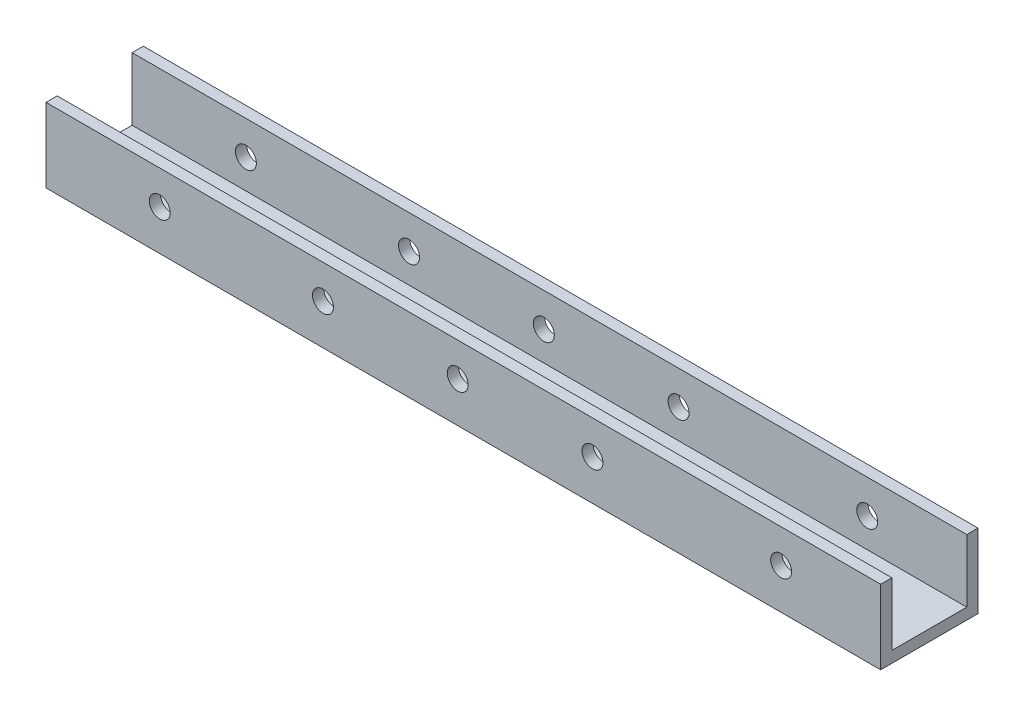
ISO-10303-21;
HEADER;
FILE_DESCRIPTION(('STEP AP214'),'2;1');
FILE_NAME('part.step','',(''),(''),'','','');
FILE_SCHEMA(('AUTOMOTIVE_DESIGN { 1 0 10303 214 1 1 1 1 }'));
ENDSEC;
DATA;
#1=APPLICATION_CONTEXT('core data for automotive mechanical design processes');
#2=APPLICATION_PROTOCOL_DEFINITION('international standard','automotive_design',2000,#1);
#3=PRODUCT_CONTEXT('',#1,'mechanical');
#4=PRODUCT('Part','Part','',(#3));
#5=PRODUCT_RELATED_PRODUCT_CATEGORY('part','',(#4));
#6=PRODUCT_DEFINITION_FORMATION('','',#4);
#7=PRODUCT_DEFINITION_CONTEXT('part definition',#1,'design');
#8=PRODUCT_DEFINITION('design','',#6,#7);
#9=PRODUCT_DEFINITION_SHAPE('','',#8);
#10=(LENGTH_UNIT() NAMED_UNIT(*) SI_UNIT(.MILLI.,.METRE.));
#11=(NAMED_UNIT(*) PLANE_ANGLE_UNIT() SI_UNIT($,.RADIAN.));
#12=(NAMED_UNIT(*) SI_UNIT($,.STERADIAN.) SOLID_ANGLE_UNIT());
#13=UNCERTAINTY_MEASURE_WITH_UNIT(LENGTH_MEASURE(1.E-05),#10,'distance_accuracy_value','');
#14=(GEOMETRIC_REPRESENTATION_CONTEXT(3) GLOBAL_UNCERTAINTY_ASSIGNED_CONTEXT((#13)) GLOBAL_UNIT_ASSIGNED_CONTEXT((#10,
#11,#12)) REPRESENTATION_CONTEXT('',''));
#15=CARTESIAN_POINT('',(0.,0.,0.));
#16=DIRECTION('',(0.,0.,1.));
#17=DIRECTION('',(1.,0.,0.));
#18=AXIS2_PLACEMENT_3D('',#15,#16,#17);
#19=CARTESIAN_POINT('',(0.,1.5,0.));
#20=DIRECTION('',(0.,-1.,0.));
#21=DIRECTION('',(0.,0.,-1.));
#22=AXIS2_PLACEMENT_3D('',#19,#20,#21);
#23=PLANE('',#22);
#24=DIRECTION('',(-1.,0.,0.));
#25=VECTOR('',#24,1.);
#26=CARTESIAN_POINT('',(0.,1.5,-1.5));
#27=LINE('',#26,#25);
#28=CARTESIAN_POINT('',(111.5,1.5,-1.5));
#29=VERTEX_POINT('',#28);
#30=CARTESIAN_POINT('',(0.,1.5,-1.5));
#31=VERTEX_POINT('',#30);
#32=EDGE_CURVE('E50',#29,#31,#27,.T.);
#33=ORIENTED_EDGE('',*,*,#32,.F.);
#34=DIRECTION('',(0.,0.,-1.));
#35=VECTOR('',#34,1.);
#36=CARTESIAN_POINT('',(111.5,1.5,-13.));
#37=LINE('',#36,#35);
#38=CARTESIAN_POINT('',(111.5,1.5,-11.5));
#39=VERTEX_POINT('',#38);
#40=EDGE_CURVE('E120',#29,#39,#37,.T.);
#41=ORIENTED_EDGE('',*,*,#40,.T.);
#42=DIRECTION('',(1.,0.,0.));
#43=VECTOR('',#42,1.);
#44=CARTESIAN_POINT('',(0.,1.5,-11.5));
#45=LINE('',#44,#43);
#46=CARTESIAN_POINT('',(0.,1.5,-11.5));
#47=VERTEX_POINT('',#46);
#48=EDGE_CURVE('E121',#47,#39,#45,.T.);
#49=ORIENTED_EDGE('',*,*,#48,.F.);
#50=DIRECTION('',(0.,0.,1.));
#51=VECTOR('',#50,1.);
#52=CARTESIAN_POINT('',(0.,1.5,0.));
#53=LINE('',#52,#51);
#54=EDGE_CURVE('E55',#47,#31,#53,.T.);
#55=ORIENTED_EDGE('',*,*,#54,.T.);
#56=EDGE_LOOP('',(#33,#41,#49,#55));
#57=FACE_BOUND('',#56,.T.);
#58=ADVANCED_FACE('F33',(#57),#23,.F.);
#59=CARTESIAN_POINT('',(111.5,1.5,0.));
#60=DIRECTION('',(0.,0.,-1.));
#61=DIRECTION('',(-1.,0.,0.));
#62=AXIS2_PLACEMENT_3D('',#59,#60,#61);
#63=PLANE('',#62);
#64=CARTESIAN_POINT('',(98.2002784814316,5.4,0.));
#65=DIRECTION('',(0.,0.,1.));
#66=DIRECTION('',(1.,0.,0.));
#67=AXIS2_PLACEMENT_3D('',#64,#65,#66);
#68=CIRCLE('',#67,1.4);
#69=CARTESIAN_POINT('',(99.6002784814316,5.4,0.));
#70=VERTEX_POINT('',#69);
#71=EDGE_CURVE('E459',#70,#70,#68,.T.);
#72=ORIENTED_EDGE('',*,*,#71,.F.);
#73=EDGE_LOOP('',(#72));
#74=FACE_BOUND('',#73,.T.);
#75=CARTESIAN_POINT('',(15.2002784814316,5.4,0.));
#76=DIRECTION('',(0.,0.,1.));
#77=DIRECTION('',(1.,0.,0.));
#78=AXIS2_PLACEMENT_3D('',#75,#76,#77);
#79=CIRCLE('',#78,1.4);
#80=CARTESIAN_POINT('',(16.6002784814316,5.4,0.));
#81=VERTEX_POINT('',#80);
#82=EDGE_CURVE('E173',#81,#81,#79,.T.);
#83=ORIENTED_EDGE('',*,*,#82,.F.);
#84=EDGE_LOOP('',(#83));
#85=FACE_BOUND('',#84,.T.);
#86=CARTESIAN_POINT('',(73.,5.4,0.));
#87=DIRECTION('',(0.,0.,1.));
#88=DIRECTION('',(1.,0.,0.));
#89=AXIS2_PLACEMENT_3D('',#86,#87,#88);
#90=CIRCLE('',#89,1.39999999999999);
#91=CARTESIAN_POINT('',(74.4,5.4,0.));
#92=VERTEX_POINT('',#91);
#93=EDGE_CURVE('E169',#92,#92,#90,.T.);
#94=ORIENTED_EDGE('',*,*,#93,.F.);
#95=EDGE_LOOP('',(#94));
#96=FACE_BOUND('',#95,.T.);
#97=CARTESIAN_POINT('',(55.,5.4,0.));
#98=DIRECTION('',(0.,0.,1.));
#99=DIRECTION('',(1.,0.,0.));
#100=AXIS2_PLACEMENT_3D('',#97,#98,#99);
#101=CIRCLE('',#100,1.4);
#102=CARTESIAN_POINT('',(56.4,5.4,0.));
#103=VERTEX_POINT('',#102);
#104=EDGE_CURVE('E165',#103,#103,#101,.T.);
#105=ORIENTED_EDGE('',*,*,#104,.F.);
#106=EDGE_LOOP('',(#105));
#107=FACE_BOUND('',#106,.T.);
#108=CARTESIAN_POINT('',(37.,5.4,0.));
#109=DIRECTION('',(0.,0.,1.));
#110=DIRECTION('',(1.,0.,0.));
#111=AXIS2_PLACEMENT_3D('',#108,#109,#110);
#112=CIRCLE('',#111,1.4);
#113=CARTESIAN_POINT('',(38.4,5.4,0.));
#114=VERTEX_POINT('',#113);
#115=EDGE_CURVE('E160',#114,#114,#112,.T.);
#116=ORIENTED_EDGE('',*,*,#115,.F.);
#117=EDGE_LOOP('',(#116));
#118=FACE_BOUND('',#117,.T.);
#119=DIRECTION('',(1.,0.,0.));
#120=VECTOR('',#119,1.);
#121=CARTESIAN_POINT('',(111.5,0.,0.));
#122=LINE('',#121,#120);
#123=CARTESIAN_POINT('',(0.,0.,0.));
#124=VERTEX_POINT('',#123);
#125=CARTESIAN_POINT('',(111.5,0.,0.));
#126=VERTEX_POINT('',#125);
#127=EDGE_CURVE('E151',#124,#126,#122,.T.);
#128=ORIENTED_EDGE('',*,*,#127,.T.);
#129=DIRECTION('',(0.,-1.,0.));
#130=VECTOR('',#129,1.);
#131=CARTESIAN_POINT('',(111.5,1.5,0.));
#132=LINE('',#131,#130);
#133=CARTESIAN_POINT('',(111.5,9.9,0.));
#134=VERTEX_POINT('',#133);
#135=EDGE_CURVE('E11',#134,#126,#132,.T.);
#136=ORIENTED_EDGE('',*,*,#135,.F.);
#137=DIRECTION('',(1.,0.,0.));
#138=VECTOR('',#137,1.);
#139=CARTESIAN_POINT('',(111.5,9.9,0.));
#140=LINE('',#139,#138);
#141=CARTESIAN_POINT('',(0.,9.9,0.));
#142=VERTEX_POINT('',#141);
#143=EDGE_CURVE('E115',#142,#134,#140,.T.);
#144=ORIENTED_EDGE('',*,*,#143,.F.);
#145=DIRECTION('',(0.,-1.,0.));
#146=VECTOR('',#145,1.);
#147=CARTESIAN_POINT('',(0.,1.5,0.));
#148=LINE('',#147,#146);
#149=EDGE_CURVE('E217',#142,#124,#148,.T.);
#150=ORIENTED_EDGE('',*,*,#149,.T.);
#151=EDGE_LOOP('',(#128,#136,#144,#150));
#152=FACE_BOUND('',#151,.T.);
#153=ADVANCED_FACE('F35',(#74,#85,#96,#107,#118,#152),#63,.F.);
#154=CARTESIAN_POINT('',(111.5,1.5,-13.));
#155=DIRECTION('',(-1.,0.,0.));
#156=DIRECTION('',(0.,0.,1.));
#157=AXIS2_PLACEMENT_3D('',#154,#155,#156);
#158=PLANE('',#157);
#159=DIRECTION('',(0.,0.,-1.));
#160=VECTOR('',#159,1.);
#161=CARTESIAN_POINT('',(111.5,0.,-13.));
#162=LINE('',#161,#160);
#163=CARTESIAN_POINT('',(111.5,0.,-13.));
#164=VERTEX_POINT('',#163);
#165=EDGE_CURVE('E221',#126,#164,#162,.T.);
#166=ORIENTED_EDGE('',*,*,#165,.T.);
#167=DIRECTION('',(0.,-1.,0.));
#168=VECTOR('',#167,1.);
#169=CARTESIAN_POINT('',(111.5,1.5,-13.));
#170=LINE('',#169,#168);
#171=CARTESIAN_POINT('',(111.5,9.9,-13.));
#172=VERTEX_POINT('',#171);
#173=EDGE_CURVE('E42',#172,#164,#170,.T.);
#174=ORIENTED_EDGE('',*,*,#173,.F.);
#175=DIRECTION('',(0.,0.,-1.));
#176=VECTOR('',#175,1.);
#177=CARTESIAN_POINT('',(111.5,9.9,-11.5));
#178=LINE('',#177,#176);
#179=CARTESIAN_POINT('',(111.5,9.9,-11.5));
#180=VERTEX_POINT('',#179);
#181=EDGE_CURVE('E135',#180,#172,#178,.T.);
#182=ORIENTED_EDGE('',*,*,#181,.F.);
#183=DIRECTION('',(0.,-1.,0.));
#184=VECTOR('',#183,1.);
#185=CARTESIAN_POINT('',(111.5,9.9,-11.5));
#186=LINE('',#185,#184);
#187=EDGE_CURVE('E138',#180,#39,#186,.T.);
#188=ORIENTED_EDGE('',*,*,#187,.T.);
#189=ORIENTED_EDGE('',*,*,#40,.F.);
#190=DIRECTION('',(0.,-1.,0.));
#191=VECTOR('',#190,1.);
#192=CARTESIAN_POINT('',(111.5,9.9,-1.5));
#193=LINE('',#192,#191);
#194=CARTESIAN_POINT('',(111.5,9.9,-1.5));
#195=VERTEX_POINT('',#194);
#196=EDGE_CURVE('E102',#195,#29,#193,.T.);
#197=ORIENTED_EDGE('',*,*,#196,.F.);
#198=DIRECTION('',(0.,0.,-1.));
#199=VECTOR('',#198,1.);
#200=CARTESIAN_POINT('',(111.5,9.9,-1.5));
#201=LINE('',#200,#199);
#202=EDGE_CURVE('E109',#134,#195,#201,.T.);
#203=ORIENTED_EDGE('',*,*,#202,.F.);
#204=ORIENTED_EDGE('',*,*,#135,.T.);
#205=EDGE_LOOP('',(#166,#174,#182,#188,#189,#197,#203,#204));
#206=FACE_BOUND('',#205,.T.);
#207=ADVANCED_FACE('F118',(#206),#158,.F.);
#208=CARTESIAN_POINT('',(0.,1.5,-13.));
#209=DIRECTION('',(0.,0.,1.));
#210=DIRECTION('',(1.,0.,0.));
#211=AXIS2_PLACEMENT_3D('',#208,#209,#210);
#212=PLANE('',#211);
#213=CARTESIAN_POINT('',(98.2002784814316,5.4,-13.));
#214=DIRECTION('',(0.,0.,1.));
#215=DIRECTION('',(1.,0.,0.));
#216=AXIS2_PLACEMENT_3D('',#213,#214,#215);
#217=CIRCLE('',#216,1.4);
#218=CARTESIAN_POINT('',(99.6002784814316,5.4,-13.));
#219=VERTEX_POINT('',#218);
#220=EDGE_CURVE('E180',#219,#219,#217,.T.);
#221=ORIENTED_EDGE('',*,*,#220,.T.);
#222=EDGE_LOOP('',(#221));
#223=FACE_BOUND('',#222,.T.);
#224=CARTESIAN_POINT('',(15.2002784814316,5.4,-13.));
#225=DIRECTION('',(0.,0.,1.));
#226=DIRECTION('',(1.,0.,0.));
#227=AXIS2_PLACEMENT_3D('',#224,#225,#226);
#228=CIRCLE('',#227,1.4);
#229=CARTESIAN_POINT('',(16.6002784814316,5.4,-13.));
#230=VERTEX_POINT('',#229);
#231=EDGE_CURVE('E177',#230,#230,#228,.T.);
#232=ORIENTED_EDGE('',*,*,#231,.T.);
#233=EDGE_LOOP('',(#232));
#234=FACE_BOUND('',#233,.T.);
#235=CARTESIAN_POINT('',(73.,5.4,-13.));
#236=DIRECTION('',(0.,0.,1.));
#237=DIRECTION('',(1.,0.,0.));
#238=AXIS2_PLACEMENT_3D('',#235,#236,#237);
#239=CIRCLE('',#238,1.39999999999999);
#240=CARTESIAN_POINT('',(74.4,5.4,-13.));
#241=VERTEX_POINT('',#240);
#242=EDGE_CURVE('E195',#241,#241,#239,.T.);
#243=ORIENTED_EDGE('',*,*,#242,.T.);
#244=EDGE_LOOP('',(#243));
#245=FACE_BOUND('',#244,.T.);
#246=CARTESIAN_POINT('',(55.,5.4,-13.));
#247=DIRECTION('',(0.,0.,1.));
#248=DIRECTION('',(1.,0.,0.));
#249=AXIS2_PLACEMENT_3D('',#246,#247,#248);
#250=CIRCLE('',#249,1.4);
#251=CARTESIAN_POINT('',(56.4,5.4,-13.));
#252=VERTEX_POINT('',#251);
#253=EDGE_CURVE('E202',#252,#252,#250,.T.);
#254=ORIENTED_EDGE('',*,*,#253,.T.);
#255=EDGE_LOOP('',(#254));
#256=FACE_BOUND('',#255,.T.);
#257=CARTESIAN_POINT('',(37.,5.4,-13.));
#258=DIRECTION('',(0.,0.,1.));
#259=DIRECTION('',(1.,0.,0.));
#260=AXIS2_PLACEMENT_3D('',#257,#258,#259);
#261=CIRCLE('',#260,1.4);
#262=CARTESIAN_POINT('',(38.4,5.4,-13.));
#263=VERTEX_POINT('',#262);
#264=EDGE_CURVE('E209',#263,#263,#261,.T.);
#265=ORIENTED_EDGE('',*,*,#264,.T.);
#266=EDGE_LOOP('',(#265));
#267=FACE_BOUND('',#266,.T.);
#268=DIRECTION('',(-1.,0.,0.));
#269=VECTOR('',#268,1.);
#270=CARTESIAN_POINT('',(0.,0.,-13.));
#271=LINE('',#270,#269);
#272=CARTESIAN_POINT('',(0.,0.,-13.));
#273=VERTEX_POINT('',#272);
#274=EDGE_CURVE('E226',#164,#273,#271,.T.);
#275=ORIENTED_EDGE('',*,*,#274,.T.);
#276=DIRECTION('',(0.,-1.,0.));
#277=VECTOR('',#276,1.);
#278=CARTESIAN_POINT('',(0.,1.5,-13.));
#279=LINE('',#278,#277);
#280=CARTESIAN_POINT('',(0.,9.9,-13.));
#281=VERTEX_POINT('',#280);
#282=EDGE_CURVE('E232',#281,#273,#279,.T.);
#283=ORIENTED_EDGE('',*,*,#282,.F.);
#284=DIRECTION('',(-1.,0.,0.));
#285=VECTOR('',#284,1.);
#286=CARTESIAN_POINT('',(111.5,9.9,-13.));
#287=LINE('',#286,#285);
#288=EDGE_CURVE('E124',#172,#281,#287,.T.);
#289=ORIENTED_EDGE('',*,*,#288,.F.);
#290=ORIENTED_EDGE('',*,*,#173,.T.);
#291=EDGE_LOOP('',(#275,#283,#289,#290));
#292=FACE_BOUND('',#291,.T.);
#293=ADVANCED_FACE('F230',(#223,#234,#245,#256,#267,#292),#212,.F.);
#294=CARTESIAN_POINT('',(0.,1.5,0.));
#295=DIRECTION('',(1.,0.,0.));
#296=DIRECTION('',(0.,0.,-1.));
#297=AXIS2_PLACEMENT_3D('',#294,#295,#296);
#298=PLANE('',#297);
#299=DIRECTION('',(0.,0.,1.));
#300=VECTOR('',#299,1.);
#301=CARTESIAN_POINT('',(0.,0.,0.));
#302=LINE('',#301,#300);
#303=EDGE_CURVE('E155',#273,#124,#302,.T.);
#304=ORIENTED_EDGE('',*,*,#303,.T.);
#305=ORIENTED_EDGE('',*,*,#149,.F.);
#306=DIRECTION('',(0.,0.,1.));
#307=VECTOR('',#306,1.);
#308=CARTESIAN_POINT('',(0.,9.9,0.));
#309=LINE('',#308,#307);
#310=CARTESIAN_POINT('',(0.,9.9,-1.5));
#311=VERTEX_POINT('',#310);
#312=EDGE_CURVE('E108',#311,#142,#309,.T.);
#313=ORIENTED_EDGE('',*,*,#312,.F.);
#314=DIRECTION('',(0.,-1.,0.));
#315=VECTOR('',#314,1.);
#316=CARTESIAN_POINT('',(0.,9.9,-1.5));
#317=LINE('',#316,#315);
#318=EDGE_CURVE('E104',#311,#31,#317,.T.);
#319=ORIENTED_EDGE('',*,*,#318,.T.);
#320=ORIENTED_EDGE('',*,*,#54,.F.);
#321=DIRECTION('',(0.,-1.,0.));
#322=VECTOR('',#321,1.);
#323=CARTESIAN_POINT('',(0.,9.9,-11.5));
#324=LINE('',#323,#322);
#325=CARTESIAN_POINT('',(0.,9.9,-11.5));
#326=VERTEX_POINT('',#325);
#327=EDGE_CURVE('E146',#326,#47,#324,.T.);
#328=ORIENTED_EDGE('',*,*,#327,.F.);
#329=DIRECTION('',(0.,0.,1.));
#330=VECTOR('',#329,1.);
#331=CARTESIAN_POINT('',(0.,9.9,-13.));
#332=LINE('',#331,#330);
#333=EDGE_CURVE('E131',#281,#326,#332,.T.);
#334=ORIENTED_EDGE('',*,*,#333,.F.);
#335=ORIENTED_EDGE('',*,*,#282,.T.);
#336=EDGE_LOOP('',(#304,#305,#313,#319,#320,#328,#334,#335));
#337=FACE_BOUND('',#336,.T.);
#338=ADVANCED_FACE('F214',(#337),#298,.F.);
#339=CARTESIAN_POINT('',(0.,0.,0.));
#340=DIRECTION('',(0.,-1.,0.));
#341=DIRECTION('',(0.,0.,-1.));
#342=AXIS2_PLACEMENT_3D('',#339,#340,#341);
#343=PLANE('',#342);
#344=ORIENTED_EDGE('',*,*,#127,.F.);
#345=ORIENTED_EDGE('',*,*,#303,.F.);
#346=ORIENTED_EDGE('',*,*,#274,.F.);
#347=ORIENTED_EDGE('',*,*,#165,.F.);
#348=EDGE_LOOP('',(#344,#345,#346,#347));
#349=FACE_BOUND('',#348,.T.);
#350=ADVANCED_FACE('F235',(#349),#343,.T.);
#351=CARTESIAN_POINT('',(0.,9.9,-11.5));
#352=DIRECTION('',(0.,0.,-1.));
#353=DIRECTION('',(-1.,0.,0.));
#354=AXIS2_PLACEMENT_3D('',#351,#352,#353);
#355=PLANE('',#354);
#356=CARTESIAN_POINT('',(98.2002784814316,5.4,-11.5));
#357=DIRECTION('',(0.,0.,-1.));
#358=DIRECTION('',(-1.,0.,0.));
#359=AXIS2_PLACEMENT_3D('',#356,#357,#358);
#360=CIRCLE('',#359,1.4);
#361=CARTESIAN_POINT('',(96.8002784814316,5.4,-11.5));
#362=VERTEX_POINT('',#361);
#363=EDGE_CURVE('E185',#362,#362,#360,.T.);
#364=ORIENTED_EDGE('',*,*,#363,.T.);
#365=EDGE_LOOP('',(#364));
#366=FACE_BOUND('',#365,.T.);
#367=CARTESIAN_POINT('',(15.2002784814316,5.4,-11.5));
#368=DIRECTION('',(0.,0.,-1.));
#369=DIRECTION('',(-1.,0.,0.));
#370=AXIS2_PLACEMENT_3D('',#367,#368,#369);
#371=CIRCLE('',#370,1.4);
#372=CARTESIAN_POINT('',(13.8002784814316,5.4,-11.5));
#373=VERTEX_POINT('',#372);
#374=EDGE_CURVE('E172',#373,#373,#371,.T.);
#375=ORIENTED_EDGE('',*,*,#374,.T.);
#376=EDGE_LOOP('',(#375));
#377=FACE_BOUND('',#376,.T.);
#378=CARTESIAN_POINT('',(73.,5.4,-11.5));
#379=DIRECTION('',(0.,0.,-1.));
#380=DIRECTION('',(-1.,0.,0.));
#381=AXIS2_PLACEMENT_3D('',#378,#379,#380);
#382=CIRCLE('',#381,1.39999999999999);
#383=CARTESIAN_POINT('',(71.6,5.4,-11.5));
#384=VERTEX_POINT('',#383);
#385=EDGE_CURVE('E168',#384,#384,#382,.T.);
#386=ORIENTED_EDGE('',*,*,#385,.T.);
#387=EDGE_LOOP('',(#386));
#388=FACE_BOUND('',#387,.T.);
#389=CARTESIAN_POINT('',(55.,5.4,-11.5));
#390=DIRECTION('',(0.,0.,-1.));
#391=DIRECTION('',(-1.,0.,0.));
#392=AXIS2_PLACEMENT_3D('',#389,#390,#391);
#393=CIRCLE('',#392,1.4);
#394=CARTESIAN_POINT('',(53.6,5.4,-11.5));
#395=VERTEX_POINT('',#394);
#396=EDGE_CURVE('E164',#395,#395,#393,.T.);
#397=ORIENTED_EDGE('',*,*,#396,.T.);
#398=EDGE_LOOP('',(#397));
#399=FACE_BOUND('',#398,.T.);
#400=CARTESIAN_POINT('',(37.,5.4,-11.5));
#401=DIRECTION('',(0.,0.,-1.));
#402=DIRECTION('',(-1.,0.,0.));
#403=AXIS2_PLACEMENT_3D('',#400,#401,#402);
#404=CIRCLE('',#403,1.4);
#405=CARTESIAN_POINT('',(35.6,5.4,-11.5));
#406=VERTEX_POINT('',#405);
#407=EDGE_CURVE('E159',#406,#406,#404,.T.);
#408=ORIENTED_EDGE('',*,*,#407,.T.);
#409=EDGE_LOOP('',(#408));
#410=FACE_BOUND('',#409,.T.);
#411=ORIENTED_EDGE('',*,*,#48,.T.);
#412=ORIENTED_EDGE('',*,*,#187,.F.);
#413=DIRECTION('',(1.,0.,0.));
#414=VECTOR('',#413,1.);
#415=CARTESIAN_POINT('',(0.,9.9,-11.5));
#416=LINE('',#415,#414);
#417=EDGE_CURVE('E133',#326,#180,#416,.T.);
#418=ORIENTED_EDGE('',*,*,#417,.F.);
#419=ORIENTED_EDGE('',*,*,#327,.T.);
#420=EDGE_LOOP('',(#411,#412,#418,#419));
#421=FACE_BOUND('',#420,.T.);
#422=ADVANCED_FACE('F247',(#366,#377,#388,#399,#410,#421),#355,.F.);
#423=CARTESIAN_POINT('',(0.,9.9,0.));
#424=DIRECTION('',(0.,1.,0.));
#425=DIRECTION('',(0.,0.,1.));
#426=AXIS2_PLACEMENT_3D('',#423,#424,#425);
#427=PLANE('',#426);
#428=ORIENTED_EDGE('',*,*,#288,.T.);
#429=ORIENTED_EDGE('',*,*,#333,.T.);
#430=ORIENTED_EDGE('',*,*,#417,.T.);
#431=ORIENTED_EDGE('',*,*,#181,.T.);
#432=EDGE_LOOP('',(#428,#429,#430,#431));
#433=FACE_BOUND('',#432,.T.);
#434=ADVANCED_FACE('F244',(#433),#427,.T.);
#435=CARTESIAN_POINT('',(0.,9.9,-1.5));
#436=DIRECTION('',(0.,0.,1.));
#437=DIRECTION('',(1.,0.,0.));
#438=AXIS2_PLACEMENT_3D('',#435,#436,#437);
#439=PLANE('',#438);
#440=CARTESIAN_POINT('',(98.2002784814316,5.4,-1.5));
#441=DIRECTION('',(0.,0.,1.));
#442=DIRECTION('',(1.,0.,0.));
#443=AXIS2_PLACEMENT_3D('',#440,#441,#442);
#444=CIRCLE('',#443,1.4);
#445=CARTESIAN_POINT('',(99.6002784814316,5.4,-1.5));
#446=VERTEX_POINT('',#445);
#447=EDGE_CURVE('E37',#446,#446,#444,.T.);
#448=ORIENTED_EDGE('',*,*,#447,.T.);
#449=EDGE_LOOP('',(#448));
#450=FACE_BOUND('',#449,.T.);
#451=CARTESIAN_POINT('',(15.2002784814316,5.4,-1.5));
#452=DIRECTION('',(0.,0.,1.));
#453=DIRECTION('',(1.,0.,0.));
#454=AXIS2_PLACEMENT_3D('',#451,#452,#453);
#455=CIRCLE('',#454,1.4);
#456=CARTESIAN_POINT('',(16.6002784814316,5.4,-1.5));
#457=VERTEX_POINT('',#456);
#458=EDGE_CURVE('E170',#457,#457,#455,.T.);
#459=ORIENTED_EDGE('',*,*,#458,.T.);
#460=EDGE_LOOP('',(#459));
#461=FACE_BOUND('',#460,.T.);
#462=CARTESIAN_POINT('',(73.,5.4,-1.5));
#463=DIRECTION('',(0.,0.,1.));
#464=DIRECTION('',(1.,0.,0.));
#465=AXIS2_PLACEMENT_3D('',#462,#463,#464);
#466=CIRCLE('',#465,1.39999999999999);
#467=CARTESIAN_POINT('',(74.4,5.4,-1.5));
#468=VERTEX_POINT('',#467);
#469=EDGE_CURVE('E166',#468,#468,#466,.T.);
#470=ORIENTED_EDGE('',*,*,#469,.T.);
#471=EDGE_LOOP('',(#470));
#472=FACE_BOUND('',#471,.T.);
#473=CARTESIAN_POINT('',(55.,5.4,-1.5));
#474=DIRECTION('',(0.,0.,1.));
#475=DIRECTION('',(1.,0.,0.));
#476=AXIS2_PLACEMENT_3D('',#473,#474,#475);
#477=CIRCLE('',#476,1.4);
#478=CARTESIAN_POINT('',(56.4,5.4,-1.5));
#479=VERTEX_POINT('',#478);
#480=EDGE_CURVE('E161',#479,#479,#477,.T.);
#481=ORIENTED_EDGE('',*,*,#480,.T.);
#482=EDGE_LOOP('',(#481));
#483=FACE_BOUND('',#482,.T.);
#484=CARTESIAN_POINT('',(37.,5.4,-1.5));
#485=DIRECTION('',(0.,0.,1.));
#486=DIRECTION('',(1.,0.,0.));
#487=AXIS2_PLACEMENT_3D('',#484,#485,#486);
#488=CIRCLE('',#487,1.4);
#489=CARTESIAN_POINT('',(38.4,5.4,-1.5));
#490=VERTEX_POINT('',#489);
#491=EDGE_CURVE('E156',#490,#490,#488,.T.);
#492=ORIENTED_EDGE('',*,*,#491,.T.);
#493=EDGE_LOOP('',(#492));
#494=FACE_BOUND('',#493,.T.);
#495=ORIENTED_EDGE('',*,*,#32,.T.);
#496=ORIENTED_EDGE('',*,*,#318,.F.);
#497=DIRECTION('',(-1.,0.,0.));
#498=VECTOR('',#497,1.);
#499=CARTESIAN_POINT('',(0.,9.9,-1.5));
#500=LINE('',#499,#498);
#501=EDGE_CURVE('E98',#195,#311,#500,.T.);
#502=ORIENTED_EDGE('',*,*,#501,.F.);
#503=ORIENTED_EDGE('',*,*,#196,.T.);
#504=EDGE_LOOP('',(#495,#496,#502,#503));
#505=FACE_BOUND('',#504,.T.);
#506=ADVANCED_FACE('F100',(#450,#461,#472,#483,#494,#505),#439,.F.);
#507=CARTESIAN_POINT('',(0.,9.9,0.));
#508=DIRECTION('',(0.,-1.,0.));
#509=DIRECTION('',(0.,0.,-1.));
#510=AXIS2_PLACEMENT_3D('',#507,#508,#509);
#511=PLANE('',#510);
#512=ORIENTED_EDGE('',*,*,#202,.T.);
#513=ORIENTED_EDGE('',*,*,#501,.T.);
#514=ORIENTED_EDGE('',*,*,#312,.T.);
#515=ORIENTED_EDGE('',*,*,#143,.T.);
#516=EDGE_LOOP('',(#512,#513,#514,#515));
#517=FACE_BOUND('',#516,.T.);
#518=ADVANCED_FACE('F113',(#517),#511,.F.);
#519=CARTESIAN_POINT('',(37.,5.4,-20.));
#520=DIRECTION('',(0.,0.,1.));
#521=DIRECTION('',(1.,0.,0.));
#522=AXIS2_PLACEMENT_3D('',#519,#520,#521);
#523=CYLINDRICAL_SURFACE('',#522,1.4);
#524=ORIENTED_EDGE('',*,*,#115,.T.);
#525=EDGE_LOOP('',(#524));
#526=FACE_BOUND('',#525,.T.);
#527=ORIENTED_EDGE('',*,*,#491,.F.);
#528=EDGE_LOOP('',(#527));
#529=FACE_BOUND('',#528,.T.);
#530=ADVANCED_FACE('F305',(#526,#529),#523,.F.);
#531=ORIENTED_EDGE('',*,*,#407,.F.);
#532=EDGE_LOOP('',(#531));
#533=FACE_BOUND('',#532,.T.);
#534=ORIENTED_EDGE('',*,*,#264,.F.);
#535=EDGE_LOOP('',(#534));
#536=FACE_BOUND('',#535,.T.);
#537=ADVANCED_FACE('F311',(#533,#536),#523,.F.);
#538=CARTESIAN_POINT('',(55.,5.4,-20.));
#539=DIRECTION('',(0.,0.,1.));
#540=DIRECTION('',(1.,0.,0.));
#541=AXIS2_PLACEMENT_3D('',#538,#539,#540);
#542=CYLINDRICAL_SURFACE('',#541,1.4);
#543=ORIENTED_EDGE('',*,*,#104,.T.);
#544=EDGE_LOOP('',(#543));
#545=FACE_BOUND('',#544,.T.);
#546=ORIENTED_EDGE('',*,*,#480,.F.);
#547=EDGE_LOOP('',(#546));
#548=FACE_BOUND('',#547,.T.);
#549=ADVANCED_FACE('F319',(#545,#548),#542,.F.);
#550=ORIENTED_EDGE('',*,*,#396,.F.);
#551=EDGE_LOOP('',(#550));
#552=FACE_BOUND('',#551,.T.);
#553=ORIENTED_EDGE('',*,*,#253,.F.);
#554=EDGE_LOOP('',(#553));
#555=FACE_BOUND('',#554,.T.);
#556=ADVANCED_FACE('F326',(#552,#555),#542,.F.);
#557=CARTESIAN_POINT('',(73.,5.4,-20.));
#558=DIRECTION('',(0.,0.,1.));
#559=DIRECTION('',(1.,0.,0.));
#560=AXIS2_PLACEMENT_3D('',#557,#558,#559);
#561=CYLINDRICAL_SURFACE('',#560,1.39999999999999);
#562=ORIENTED_EDGE('',*,*,#93,.T.);
#563=EDGE_LOOP('',(#562));
#564=FACE_BOUND('',#563,.T.);
#565=ORIENTED_EDGE('',*,*,#469,.F.);
#566=EDGE_LOOP('',(#565));
#567=FACE_BOUND('',#566,.T.);
#568=ADVANCED_FACE('F334',(#564,#567),#561,.F.);
#569=ORIENTED_EDGE('',*,*,#385,.F.);
#570=EDGE_LOOP('',(#569));
#571=FACE_BOUND('',#570,.T.);
#572=ORIENTED_EDGE('',*,*,#242,.F.);
#573=EDGE_LOOP('',(#572));
#574=FACE_BOUND('',#573,.T.);
#575=ADVANCED_FACE('F341',(#571,#574),#561,.F.);
#576=CARTESIAN_POINT('',(15.2002784814316,5.4,-20.));
#577=DIRECTION('',(0.,0.,1.));
#578=DIRECTION('',(1.,0.,0.));
#579=AXIS2_PLACEMENT_3D('',#576,#577,#578);
#580=CYLINDRICAL_SURFACE('',#579,1.4);
#581=ORIENTED_EDGE('',*,*,#82,.T.);
#582=EDGE_LOOP('',(#581));
#583=FACE_BOUND('',#582,.T.);
#584=ORIENTED_EDGE('',*,*,#458,.F.);
#585=EDGE_LOOP('',(#584));
#586=FACE_BOUND('',#585,.T.);
#587=ADVANCED_FACE('F349',(#583,#586),#580,.F.);
#588=ORIENTED_EDGE('',*,*,#374,.F.);
#589=EDGE_LOOP('',(#588));
#590=FACE_BOUND('',#589,.T.);
#591=ORIENTED_EDGE('',*,*,#231,.F.);
#592=EDGE_LOOP('',(#591));
#593=FACE_BOUND('',#592,.T.);
#594=ADVANCED_FACE('F356',(#590,#593),#580,.F.);
#595=CARTESIAN_POINT('',(98.2002784814316,5.4,-20.));
#596=DIRECTION('',(0.,0.,1.));
#597=DIRECTION('',(1.,0.,0.));
#598=AXIS2_PLACEMENT_3D('',#595,#596,#597);
#599=CYLINDRICAL_SURFACE('',#598,1.4);
#600=ORIENTED_EDGE('',*,*,#71,.T.);
#601=EDGE_LOOP('',(#600));
#602=FACE_BOUND('',#601,.T.);
#603=ORIENTED_EDGE('',*,*,#447,.F.);
#604=EDGE_LOOP('',(#603));
#605=FACE_BOUND('',#604,.T.);
#606=ADVANCED_FACE('F363',(#602,#605),#599,.F.);
#607=ORIENTED_EDGE('',*,*,#363,.F.);
#608=EDGE_LOOP('',(#607));
#609=FACE_BOUND('',#608,.T.);
#610=ORIENTED_EDGE('',*,*,#220,.F.);
#611=EDGE_LOOP('',(#610));
#612=FACE_BOUND('',#611,.T.);
#613=ADVANCED_FACE('F370',(#609,#612),#599,.F.);
#614=CLOSED_SHELL('',(#58,#153,#207,#293,#338,#350,#422,#434,#506,#518,#530,#537,#549,#556,#568,
#575,#587,#594,#606,#613));
#615=MANIFOLD_SOLID_BREP('B2',#614);
#616=ADVANCED_BREP_SHAPE_REPRESENTATION('',(#18,#615),#14);
#617=SHAPE_DEFINITION_REPRESENTATION(#9,#616);
ENDSEC;
END-ISO-10303-21;
